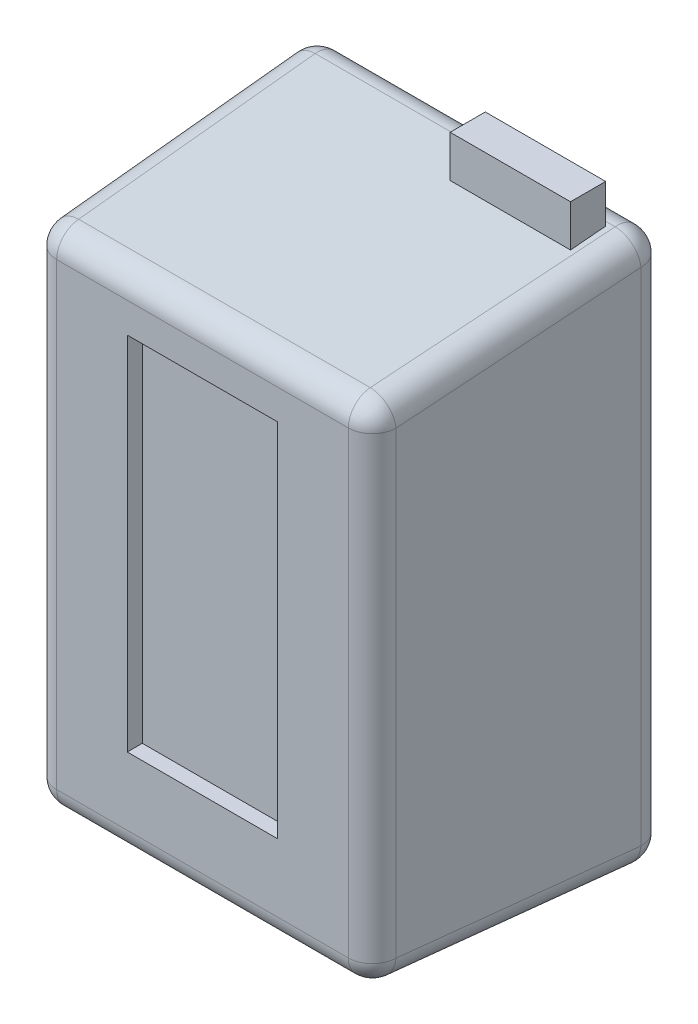
ISO-10303-21;
HEADER;
FILE_DESCRIPTION(('STEP AP214'),'2;1');
FILE_NAME('part.step','',(''),(''),'','','');
FILE_SCHEMA(('AUTOMOTIVE_DESIGN { 1 0 10303 214 1 1 1 1 }'));
ENDSEC;
DATA;
#1=APPLICATION_CONTEXT('core data for automotive mechanical design processes');
#2=APPLICATION_PROTOCOL_DEFINITION('international standard','automotive_design',2000,#1);
#3=PRODUCT_CONTEXT('',#1,'mechanical');
#4=PRODUCT('Part','Part','',(#3));
#5=PRODUCT_RELATED_PRODUCT_CATEGORY('part','',(#4));
#6=PRODUCT_DEFINITION_FORMATION('','',#4);
#7=PRODUCT_DEFINITION_CONTEXT('part definition',#1,'design');
#8=PRODUCT_DEFINITION('design','',#6,#7);
#9=PRODUCT_DEFINITION_SHAPE('','',#8);
#10=(LENGTH_UNIT() NAMED_UNIT(*) SI_UNIT(.MILLI.,.METRE.));
#11=(NAMED_UNIT(*) PLANE_ANGLE_UNIT() SI_UNIT($,.RADIAN.));
#12=(NAMED_UNIT(*) SI_UNIT($,.STERADIAN.) SOLID_ANGLE_UNIT());
#13=UNCERTAINTY_MEASURE_WITH_UNIT(LENGTH_MEASURE(1.E-05),#10,'distance_accuracy_value','');
#14=(GEOMETRIC_REPRESENTATION_CONTEXT(3) GLOBAL_UNCERTAINTY_ASSIGNED_CONTEXT((#13)) GLOBAL_UNIT_ASSIGNED_CONTEXT((#10,
#11,#12)) REPRESENTATION_CONTEXT('',''));
#15=CARTESIAN_POINT('',(0.,0.,0.));
#16=DIRECTION('',(0.,0.,1.));
#17=DIRECTION('',(1.,0.,0.));
#18=AXIS2_PLACEMENT_3D('',#15,#16,#17);
#19=CARTESIAN_POINT('',(0.,0.,57.785));
#20=DIRECTION('',(0.,0.,1.));
#21=DIRECTION('',(1.,0.,0.));
#22=AXIS2_PLACEMENT_3D('',#19,#20,#21);
#23=PLANE('',#22);
#24=DIRECTION('',(1.,0.,0.));
#25=VECTOR('',#24,1.);
#26=CARTESIAN_POINT('',(52.705,100.501728707451,57.785));
#27=LINE('',#26,#25);
#28=CARTESIAN_POINT('',(52.705,100.501728707451,57.785));
#29=VERTEX_POINT('',#28);
#30=CARTESIAN_POINT('',(20.955,100.501728707451,57.785));
#31=VERTEX_POINT('',#30);
#32=EDGE_CURVE('E779',#29,#31,#27,.F.);
#33=ORIENTED_EDGE('',*,*,#32,.T.);
#34=DIRECTION('',(0.,1.,0.));
#35=VECTOR('',#34,1.);
#36=CARTESIAN_POINT('',(20.955,100.501728707451,57.785));
#37=LINE('',#36,#35);
#38=CARTESIAN_POINT('',(20.955,24.3017287074512,57.785));
#39=VERTEX_POINT('',#38);
#40=EDGE_CURVE('E796',#31,#39,#37,.F.);
#41=ORIENTED_EDGE('',*,*,#40,.T.);
#42=DIRECTION('',(1.,0.,0.));
#43=VECTOR('',#42,1.);
#44=CARTESIAN_POINT('',(20.955,24.3017287074512,57.785));
#45=LINE('',#44,#43);
#46=CARTESIAN_POINT('',(52.705,24.3017287074512,57.785));
#47=VERTEX_POINT('',#46);
#48=EDGE_CURVE('E787',#39,#47,#45,.T.);
#49=ORIENTED_EDGE('',*,*,#48,.T.);
#50=DIRECTION('',(0.,1.,0.));
#51=VECTOR('',#50,1.);
#52=CARTESIAN_POINT('',(52.705,24.3017287074512,57.785));
#53=LINE('',#52,#51);
#54=EDGE_CURVE('E781',#47,#29,#53,.T.);
#55=ORIENTED_EDGE('',*,*,#54,.T.);
#56=EDGE_LOOP('',(#33,#41,#49,#55));
#57=FACE_BOUND('',#56,.T.);
#58=ADVANCED_FACE('F17',(#57),#23,.T.);
#59=CARTESIAN_POINT('',(52.705,100.501728707451,60.96));
#60=DIRECTION('',(0.,1.,0.));
#61=DIRECTION('',(0.,0.,1.));
#62=AXIS2_PLACEMENT_3D('',#59,#60,#61);
#63=PLANE('',#62);
#64=ORIENTED_EDGE('',*,*,#32,.F.);
#65=DIRECTION('',(0.,0.,-1.));
#66=VECTOR('',#65,1.);
#67=CARTESIAN_POINT('',(52.705,100.501728707451,60.96));
#68=LINE('',#67,#66);
#69=CARTESIAN_POINT('',(52.705,100.501728707451,60.96));
#70=VERTEX_POINT('',#69);
#71=EDGE_CURVE('E784',#29,#70,#68,.F.);
#72=ORIENTED_EDGE('',*,*,#71,.T.);
#73=DIRECTION('',(1.,0.,0.));
#74=VECTOR('',#73,1.);
#75=CARTESIAN_POINT('',(0.,100.501728707451,60.96));
#76=LINE('',#75,#74);
#77=CARTESIAN_POINT('',(20.955,100.501728707451,60.96));
#78=VERTEX_POINT('',#77);
#79=EDGE_CURVE('E237',#78,#70,#76,.T.);
#80=ORIENTED_EDGE('',*,*,#79,.F.);
#81=DIRECTION('',(0.,0.,1.));
#82=VECTOR('',#81,1.);
#83=CARTESIAN_POINT('',(20.955,100.501728707451,60.96));
#84=LINE('',#83,#82);
#85=EDGE_CURVE('E793',#78,#31,#84,.F.);
#86=ORIENTED_EDGE('',*,*,#85,.T.);
#87=EDGE_LOOP('',(#64,#72,#80,#86));
#88=FACE_BOUND('',#87,.T.);
#89=ADVANCED_FACE('F278',(#88),#63,.F.);
#90=CARTESIAN_POINT('',(52.705,24.3017287074512,60.96));
#91=DIRECTION('',(1.,0.,0.));
#92=DIRECTION('',(0.,0.,-1.));
#93=AXIS2_PLACEMENT_3D('',#90,#91,#92);
#94=PLANE('',#93);
#95=ORIENTED_EDGE('',*,*,#54,.F.);
#96=DIRECTION('',(0.,0.,-1.));
#97=VECTOR('',#96,1.);
#98=CARTESIAN_POINT('',(52.705,24.3017287074512,60.96));
#99=LINE('',#98,#97);
#100=CARTESIAN_POINT('',(52.705,24.3017287074512,60.96));
#101=VERTEX_POINT('',#100);
#102=EDGE_CURVE('E790',#47,#101,#99,.F.);
#103=ORIENTED_EDGE('',*,*,#102,.T.);
#104=DIRECTION('',(0.,1.,0.));
#105=VECTOR('',#104,1.);
#106=CARTESIAN_POINT('',(52.705,0.,60.96));
#107=LINE('',#106,#105);
#108=EDGE_CURVE('E230',#70,#101,#107,.F.);
#109=ORIENTED_EDGE('',*,*,#108,.F.);
#110=ORIENTED_EDGE('',*,*,#71,.F.);
#111=EDGE_LOOP('',(#95,#103,#109,#110));
#112=FACE_BOUND('',#111,.T.);
#113=ADVANCED_FACE('F275',(#112),#94,.F.);
#114=CARTESIAN_POINT('',(20.955,24.3017287074512,60.96));
#115=DIRECTION('',(0.,-1.,0.));
#116=DIRECTION('',(0.,0.,-1.));
#117=AXIS2_PLACEMENT_3D('',#114,#115,#116);
#118=PLANE('',#117);
#119=ORIENTED_EDGE('',*,*,#48,.F.);
#120=DIRECTION('',(0.,0.,1.));
#121=VECTOR('',#120,1.);
#122=CARTESIAN_POINT('',(20.955,24.3017287074512,60.96));
#123=LINE('',#122,#121);
#124=CARTESIAN_POINT('',(20.955,24.3017287074512,60.96));
#125=VERTEX_POINT('',#124);
#126=EDGE_CURVE('E239',#39,#125,#123,.T.);
#127=ORIENTED_EDGE('',*,*,#126,.T.);
#128=DIRECTION('',(1.,0.,0.));
#129=VECTOR('',#128,1.);
#130=CARTESIAN_POINT('',(0.,24.3017287074512,60.96));
#131=LINE('',#130,#129);
#132=EDGE_CURVE('E111',#101,#125,#131,.F.);
#133=ORIENTED_EDGE('',*,*,#132,.F.);
#134=ORIENTED_EDGE('',*,*,#102,.F.);
#135=EDGE_LOOP('',(#119,#127,#133,#134));
#136=FACE_BOUND('',#135,.T.);
#137=ADVANCED_FACE('F271',(#136),#118,.F.);
#138=CARTESIAN_POINT('',(20.955,100.501728707451,60.96));
#139=DIRECTION('',(-1.,0.,0.));
#140=DIRECTION('',(0.,0.,1.));
#141=AXIS2_PLACEMENT_3D('',#138,#139,#140);
#142=PLANE('',#141);
#143=ORIENTED_EDGE('',*,*,#40,.F.);
#144=ORIENTED_EDGE('',*,*,#85,.F.);
#145=DIRECTION('',(0.,1.,0.));
#146=VECTOR('',#145,1.);
#147=CARTESIAN_POINT('',(20.955,0.,60.96));
#148=LINE('',#147,#146);
#149=EDGE_CURVE('E224',#125,#78,#148,.T.);
#150=ORIENTED_EDGE('',*,*,#149,.F.);
#151=ORIENTED_EDGE('',*,*,#126,.F.);
#152=EDGE_LOOP('',(#143,#144,#150,#151));
#153=FACE_BOUND('',#152,.T.);
#154=ADVANCED_FACE('F267',(#153),#142,.F.);
#155=CARTESIAN_POINT('',(67.6038371453482,9.98827129254884,55.88));
#156=DIRECTION('',(-0.707537400109921,-0.704952373679696,0.0493252297415398));
#157=DIRECTION('',(0.706461997512717,-0.703880901465571,0.0739129394785272));
#158=AXIS2_PLACEMENT_3D('',#155,#156,#157);
#159=SPHERICAL_SURFACE('',#158,5.08);
#160=CARTESIAN_POINT('',(67.6038371453482,9.98827129254884,55.88));
#161=DIRECTION('',(1.,0.,0.));
#162=DIRECTION('',(0.,0.,-1.));
#163=AXIS2_PLACEMENT_3D('',#160,#161,#162);
#164=CIRCLE('',#163,5.08);
#165=CARTESIAN_POINT('',(67.6038371453482,4.92760222624277,56.3227511731581));
#166=VERTEX_POINT('',#165);
#167=CARTESIAN_POINT('',(67.6038371453482,9.98827129254883,60.96));
#168=VERTEX_POINT('',#167);
#169=EDGE_CURVE('E219',#166,#168,#164,.F.);
#170=ORIENTED_EDGE('',*,*,#169,.F.);
#171=CARTESIAN_POINT('',(67.6038371453482,9.98827129254884,55.88));
#172=DIRECTION('',(0.0173860148745836,-0.0871425693158092,-0.996044125076706));
#173=DIRECTION('',(0.,0.996194698091746,-0.0871557427476582));
#174=AXIS2_PLACEMENT_3D('',#171,#172,#173);
#175=CIRCLE('',#174,5.08);
#176=CARTESIAN_POINT('',(72.6830634367426,9.98827129254883,55.9686582247014));
#177=VERTEX_POINT('',#176);
#178=EDGE_CURVE('E214',#177,#166,#175,.T.);
#179=ORIENTED_EDGE('',*,*,#178,.F.);
#180=CARTESIAN_POINT('',(67.6038371453482,9.98827129254883,55.88));
#181=DIRECTION('',(0.,1.,0.));
#182=DIRECTION('',(0.,0.,1.));
#183=AXIS2_PLACEMENT_3D('',#180,#181,#182);
#184=CIRCLE('',#183,5.08);
#185=EDGE_CURVE('E218',#168,#177,#184,.T.);
#186=ORIENTED_EDGE('',*,*,#185,.F.);
#187=EDGE_LOOP('',(#170,#179,#186));
#188=FACE_BOUND('',#187,.T.);
#189=ADVANCED_FACE('F264',(#188),#159,.T.);
#190=CARTESIAN_POINT('',(0.,124.46,0.));
#191=DIRECTION('',(0.,1.,0.));
#192=DIRECTION('',(0.,0.,1.));
#193=AXIS2_PLACEMENT_3D('',#190,#191,#192);
#194=PLANE('',#193);
#195=DIRECTION('',(-1.,0.,0.));
#196=VECTOR('',#195,1.);
#197=CARTESIAN_POINT('',(67.31,124.46,6.35));
#198=LINE('',#197,#196);
#199=CARTESIAN_POINT('',(41.91,124.46,6.35));
#200=VERTEX_POINT('',#199);
#201=CARTESIAN_POINT('',(67.31,124.46,6.35));
#202=VERTEX_POINT('',#201);
#203=EDGE_CURVE('E261',#200,#202,#198,.F.);
#204=ORIENTED_EDGE('',*,*,#203,.F.);
#205=DIRECTION('',(0.,0.,1.));
#206=VECTOR('',#205,1.);
#207=CARTESIAN_POINT('',(41.91,124.46,6.35));
#208=LINE('',#207,#206);
#209=CARTESIAN_POINT('',(41.91,124.46,13.7703514925396));
#210=VERTEX_POINT('',#209);
#211=EDGE_CURVE('E455',#210,#200,#208,.F.);
#212=ORIENTED_EDGE('',*,*,#211,.F.);
#213=DIRECTION('',(1.,0.,0.));
#214=VECTOR('',#213,1.);
#215=CARTESIAN_POINT('',(41.91,124.46,13.7703514925396));
#216=LINE('',#215,#214);
#217=CARTESIAN_POINT('',(67.31,124.46,13.7703514925396));
#218=VERTEX_POINT('',#217);
#219=EDGE_CURVE('E461',#218,#210,#216,.F.);
#220=ORIENTED_EDGE('',*,*,#219,.F.);
#221=DIRECTION('',(0.,0.,-1.));
#222=VECTOR('',#221,1.);
#223=CARTESIAN_POINT('',(67.31,124.46,13.7703514925396));
#224=LINE('',#223,#222);
#225=EDGE_CURVE('E467',#202,#218,#224,.F.);
#226=ORIENTED_EDGE('',*,*,#225,.F.);
#227=EDGE_LOOP('',(#204,#212,#220,#226));
#228=FACE_BOUND('',#227,.T.);
#229=ADVANCED_FACE('F254',(#228),#194,.T.);
#230=CARTESIAN_POINT('',(67.6038371453482,106.851728707451,55.88));
#231=DIRECTION('',(0.707537399602829,-0.704952374189057,-0.0493252297356972));
#232=DIRECTION('',(0.706461998019121,0.70388090095842,0.0739129394679565));
#233=AXIS2_PLACEMENT_3D('',#230,#231,#232);
#234=SPHERICAL_SURFACE('',#233,5.08);
#235=CARTESIAN_POINT('',(67.6038371453482,106.851728707451,55.88));
#236=DIRECTION('',(0.,1.,0.));
#237=DIRECTION('',(0.,0.,1.));
#238=AXIS2_PLACEMENT_3D('',#235,#236,#237);
#239=CIRCLE('',#238,5.08);
#240=CARTESIAN_POINT('',(72.6830634367426,106.851728707451,55.9686582247015));
#241=VERTEX_POINT('',#240);
#242=CARTESIAN_POINT('',(67.6038371453481,106.851728707451,60.96));
#243=VERTEX_POINT('',#242);
#244=EDGE_CURVE('E215',#241,#243,#239,.F.);
#245=ORIENTED_EDGE('',*,*,#244,.F.);
#246=CARTESIAN_POINT('',(67.6038371453482,106.851728707451,55.88));
#247=DIRECTION('',(0.0173860148745836,0.0871425693158093,-0.996044125076706));
#248=DIRECTION('',(0.,0.996194698091745,0.0871557427476582));
#249=AXIS2_PLACEMENT_3D('',#246,#247,#248);
#250=CIRCLE('',#249,5.08);
#251=CARTESIAN_POINT('',(67.6038371453481,111.912397773757,56.3227511731581));
#252=VERTEX_POINT('',#251);
#253=EDGE_CURVE('E430',#252,#241,#250,.T.);
#254=ORIENTED_EDGE('',*,*,#253,.F.);
#255=CARTESIAN_POINT('',(67.6038371453481,106.851728707451,55.88));
#256=DIRECTION('',(-1.,0.,0.));
#257=DIRECTION('',(0.,0.,1.));
#258=AXIS2_PLACEMENT_3D('',#255,#256,#257);
#259=CIRCLE('',#258,5.08);
#260=EDGE_CURVE('E212',#243,#252,#259,.T.);
#261=ORIENTED_EDGE('',*,*,#260,.F.);
#262=EDGE_LOOP('',(#245,#254,#261));
#263=FACE_BOUND('',#262,.T.);
#264=ADVANCED_FACE('F249',(#263),#234,.T.);
#265=CARTESIAN_POINT('',(6.05616285465185,9.98827129254884,55.88));
#266=DIRECTION('',(-0.707537399602827,0.704952374189059,-0.0493252297356956));
#267=DIRECTION('',(-0.706461998019123,-0.703880900958418,0.0739129394679551));
#268=AXIS2_PLACEMENT_3D('',#265,#266,#267);
#269=SPHERICAL_SURFACE('',#268,5.08);
#270=CARTESIAN_POINT('',(6.05616285465185,9.98827129254883,55.88));
#271=DIRECTION('',(0.,-1.,0.));
#272=DIRECTION('',(0.,0.,-1.));
#273=AXIS2_PLACEMENT_3D('',#270,#271,#272);
#274=CIRCLE('',#273,5.08);
#275=CARTESIAN_POINT('',(0.976936563257381,9.98827129254883,55.9686582247013));
#276=VERTEX_POINT('',#275);
#277=CARTESIAN_POINT('',(6.05616285465185,9.98827129254883,60.96));
#278=VERTEX_POINT('',#277);
#279=EDGE_CURVE('E202',#276,#278,#274,.F.);
#280=ORIENTED_EDGE('',*,*,#279,.F.);
#281=CARTESIAN_POINT('',(6.05616285465185,9.98827129254884,55.88));
#282=DIRECTION('',(-0.0173860148745836,-0.0871425693158092,-0.996044125076706));
#283=DIRECTION('',(0.,0.996194698091746,-0.0871557427476582));
#284=AXIS2_PLACEMENT_3D('',#281,#282,#283);
#285=CIRCLE('',#284,5.08);
#286=CARTESIAN_POINT('',(6.05616285465185,4.92760222624277,56.3227511731581));
#287=VERTEX_POINT('',#286);
#288=EDGE_CURVE('E208',#287,#276,#285,.T.);
#289=ORIENTED_EDGE('',*,*,#288,.F.);
#290=CARTESIAN_POINT('',(6.05616285465185,9.98827129254884,55.88));
#291=DIRECTION('',(1.,0.,0.));
#292=DIRECTION('',(0.,0.,-1.));
#293=AXIS2_PLACEMENT_3D('',#290,#291,#292);
#294=CIRCLE('',#293,5.08);
#295=EDGE_CURVE('E20',#278,#287,#294,.T.);
#296=ORIENTED_EDGE('',*,*,#295,.F.);
#297=EDGE_LOOP('',(#280,#289,#296));
#298=FACE_BOUND('',#297,.T.);
#299=ADVANCED_FACE('F244',(#298),#269,.T.);
#300=CARTESIAN_POINT('',(0.,0.,60.96));
#301=DIRECTION('',(0.,0.,1.));
#302=DIRECTION('',(1.,0.,0.));
#303=AXIS2_PLACEMENT_3D('',#300,#301,#302);
#304=PLANE('',#303);
#305=ORIENTED_EDGE('',*,*,#132,.T.);
#306=ORIENTED_EDGE('',*,*,#149,.T.);
#307=ORIENTED_EDGE('',*,*,#79,.T.);
#308=ORIENTED_EDGE('',*,*,#108,.T.);
#309=EDGE_LOOP('',(#305,#306,#307,#308));
#310=FACE_BOUND('',#309,.T.);
#311=DIRECTION('',(-1.,0.,0.));
#312=VECTOR('',#311,1.);
#313=CARTESIAN_POINT('',(68.9304013414186,106.851728707451,60.96));
#314=LINE('',#313,#312);
#315=CARTESIAN_POINT('',(6.05616285465185,106.851728707451,60.96));
#316=VERTEX_POINT('',#315);
#317=EDGE_CURVE('E211',#316,#243,#314,.F.);
#318=ORIENTED_EDGE('',*,*,#317,.F.);
#319=DIRECTION('',(0.,-1.,0.));
#320=VECTOR('',#319,1.);
#321=CARTESIAN_POINT('',(6.05616285465185,111.752724571596,60.96));
#322=LINE('',#321,#320);
#323=EDGE_CURVE('E205',#278,#316,#322,.F.);
#324=ORIENTED_EDGE('',*,*,#323,.F.);
#325=DIRECTION('',(1.,0.,0.));
#326=VECTOR('',#325,1.);
#327=CARTESIAN_POINT('',(4.72959865858138,9.98827129254884,60.96));
#328=LINE('',#327,#326);
#329=EDGE_CURVE('E102',#168,#278,#328,.F.);
#330=ORIENTED_EDGE('',*,*,#329,.F.);
#331=DIRECTION('',(0.,1.,0.));
#332=VECTOR('',#331,1.);
#333=CARTESIAN_POINT('',(67.6038371453482,5.09619980306344,60.96));
#334=LINE('',#333,#332);
#335=EDGE_CURVE('E217',#243,#168,#334,.F.);
#336=ORIENTED_EDGE('',*,*,#335,.F.);
#337=EDGE_LOOP('',(#318,#324,#330,#336));
#338=FACE_BOUND('',#337,.T.);
#339=ADVANCED_FACE('F248',(#310,#338),#304,.T.);
#340=CARTESIAN_POINT('',(6.05616285465185,106.851728707451,55.88));
#341=DIRECTION('',(0.707537400109922,0.704952373679695,0.0493252297415399));
#342=DIRECTION('',(-0.706461997512717,0.703880901465572,0.0739129394785272));
#343=AXIS2_PLACEMENT_3D('',#340,#341,#342);
#344=SPHERICAL_SURFACE('',#343,5.08);
#345=CARTESIAN_POINT('',(6.05616285465185,106.851728707451,55.88));
#346=DIRECTION('',(-1.,0.,0.));
#347=DIRECTION('',(0.,0.,1.));
#348=AXIS2_PLACEMENT_3D('',#345,#346,#347);
#349=CIRCLE('',#348,5.08);
#350=CARTESIAN_POINT('',(6.05616285465185,111.912397773757,56.3227511731581));
#351=VERTEX_POINT('',#350);
#352=EDGE_CURVE('E209',#351,#316,#349,.F.);
#353=ORIENTED_EDGE('',*,*,#352,.F.);
#354=CARTESIAN_POINT('',(6.05616285465185,106.851728707451,55.88));
#355=DIRECTION('',(-0.0173860148745836,0.0871425693158093,-0.996044125076706));
#356=DIRECTION('',(0.,0.996194698091745,0.0871557427476582));
#357=AXIS2_PLACEMENT_3D('',#354,#355,#356);
#358=CIRCLE('',#357,5.08);
#359=CARTESIAN_POINT('',(0.976936563257382,106.851728707451,55.9686582247014));
#360=VERTEX_POINT('',#359);
#361=EDGE_CURVE('E421',#360,#351,#358,.T.);
#362=ORIENTED_EDGE('',*,*,#361,.F.);
#363=CARTESIAN_POINT('',(6.05616285465185,106.851728707451,55.88));
#364=DIRECTION('',(0.,-1.,0.));
#365=DIRECTION('',(0.,0.,-1.));
#366=AXIS2_PLACEMENT_3D('',#363,#364,#365);
#367=CIRCLE('',#366,5.08);
#368=EDGE_CURVE('E206',#316,#360,#367,.T.);
#369=ORIENTED_EDGE('',*,*,#368,.F.);
#370=EDGE_LOOP('',(#353,#362,#369));
#371=FACE_BOUND('',#370,.T.);
#372=ADVANCED_FACE('F412',(#371),#344,.T.);
#373=CARTESIAN_POINT('',(4.72959865858138,9.98827129254884,55.88));
#374=DIRECTION('',(1.,0.,0.));
#375=DIRECTION('',(0.,0.,-1.));
#376=AXIS2_PLACEMENT_3D('',#373,#374,#375);
#377=CYLINDRICAL_SURFACE('',#376,5.08);
#378=ORIENTED_EDGE('',*,*,#169,.T.);
#379=ORIENTED_EDGE('',*,*,#329,.T.);
#380=ORIENTED_EDGE('',*,*,#295,.T.);
#381=DIRECTION('',(1.,0.,0.));
#382=VECTOR('',#381,1.);
#383=CARTESIAN_POINT('',(-27.2833581887681,4.92760222624277,56.3227511731581));
#384=LINE('',#383,#382);
#385=EDGE_CURVE('E436',#166,#287,#384,.F.);
#386=ORIENTED_EDGE('',*,*,#385,.F.);
#387=EDGE_LOOP('',(#378,#379,#380,#386));
#388=FACE_BOUND('',#387,.T.);
#389=ADVANCED_FACE('F409',(#388),#377,.T.);
#390=CARTESIAN_POINT('',(67.6038371453482,5.09619980306344,55.88));
#391=DIRECTION('',(0.,1.,0.));
#392=DIRECTION('',(0.,0.,1.));
#393=AXIS2_PLACEMENT_3D('',#390,#391,#392);
#394=CYLINDRICAL_SURFACE('',#393,5.08);
#395=ORIENTED_EDGE('',*,*,#244,.T.);
#396=ORIENTED_EDGE('',*,*,#335,.T.);
#397=ORIENTED_EDGE('',*,*,#185,.T.);
#398=DIRECTION('',(0.,1.,0.));
#399=VECTOR('',#398,1.);
#400=CARTESIAN_POINT('',(72.6830634367426,-27.2833581887681,55.9686582247014));
#401=LINE('',#400,#399);
#402=EDGE_CURVE('E433',#241,#177,#401,.F.);
#403=ORIENTED_EDGE('',*,*,#402,.F.);
#404=EDGE_LOOP('',(#395,#396,#397,#403));
#405=FACE_BOUND('',#404,.T.);
#406=ADVANCED_FACE('F405',(#405),#394,.T.);
#407=CARTESIAN_POINT('',(66.1280558113525,17.3852152225057,140.427456));
#408=DIRECTION('',(0.0173860148745836,-0.0871425693158092,-0.996044125076706));
#409=DIRECTION('',(0.,0.996194698091746,-0.0871557427476582));
#410=AXIS2_PLACEMENT_3D('',#407,#408,#409);
#411=CYLINDRICAL_SURFACE('',#410,5.08);
#412=DIRECTION('',(0.0173860148745835,-0.0871425693158092,-0.996044125076706));
#413=VECTOR('',#412,1.);
#414=CARTESIAN_POINT('',(72.6830634367426,9.98827129254884,55.9686582247014));
#415=LINE('',#414,#413);
#416=CARTESIAN_POINT('',(73.5697807350925,5.5438471877946,5.16865822490805));
#417=VERTEX_POINT('',#416);
#418=EDGE_CURVE('E438',#177,#417,#415,.T.);
#419=ORIENTED_EDGE('',*,*,#418,.F.);
#420=ORIENTED_EDGE('',*,*,#178,.T.);
#421=DIRECTION('',(-0.0173860148745835,0.0871425693158093,0.996044125076706));
#422=VECTOR('',#421,1.);
#423=CARTESIAN_POINT('',(68.4905544437016,0.483178119125831,5.5227511731581));
#424=LINE('',#423,#422);
#425=CARTESIAN_POINT('',(68.4905544389365,0.483178119140131,5.52275117332153));
#426=VERTEX_POINT('',#425);
#427=EDGE_CURVE('E439',#426,#166,#424,.T.);
#428=ORIENTED_EDGE('',*,*,#427,.F.);
#429=CARTESIAN_POINT('',(68.4905544437016,5.5438471854319,5.08));
#430=DIRECTION('',(0.0173860149555573,-0.087142569364098,-0.996044125071068));
#431=DIRECTION('',(0.706461997512716,-0.703880901465573,0.0739129394785234));
#432=AXIS2_PLACEMENT_3D('',#429,#430,#431);
#433=CIRCLE('',#432,5.08);
#434=EDGE_CURVE('E159',#417,#426,#433,.T.);
#435=ORIENTED_EDGE('',*,*,#434,.F.);
#436=EDGE_LOOP('',(#419,#420,#428,#435));
#437=FACE_BOUND('',#436,.T.);
#438=ADVANCED_FACE('F401',(#437),#411,.T.);
#439=CARTESIAN_POINT('',(68.9304013414186,106.851728707451,55.88));
#440=DIRECTION('',(-1.,0.,0.));
#441=DIRECTION('',(0.,0.,1.));
#442=AXIS2_PLACEMENT_3D('',#439,#440,#441);
#443=CYLINDRICAL_SURFACE('',#442,5.08);
#444=ORIENTED_EDGE('',*,*,#352,.T.);
#445=ORIENTED_EDGE('',*,*,#317,.T.);
#446=ORIENTED_EDGE('',*,*,#260,.T.);
#447=DIRECTION('',(1.,0.,0.));
#448=VECTOR('',#447,1.);
#449=CARTESIAN_POINT('',(100.943358188768,111.912397773757,56.3227511731581));
#450=LINE('',#449,#448);
#451=EDGE_CURVE('E155',#351,#252,#450,.T.);
#452=ORIENTED_EDGE('',*,*,#451,.F.);
#453=EDGE_LOOP('',(#444,#445,#446,#452));
#454=FACE_BOUND('',#453,.T.);
#455=ADVANCED_FACE('F397',(#454),#443,.T.);
#456=CARTESIAN_POINT('',(67.31,116.84,6.35));
#457=DIRECTION('',(0.,0.,-1.));
#458=DIRECTION('',(-1.,0.,0.));
#459=AXIS2_PLACEMENT_3D('',#456,#457,#458);
#460=PLANE('',#459);
#461=DIRECTION('',(0.,1.,0.));
#462=VECTOR('',#461,1.);
#463=CARTESIAN_POINT('',(67.31,116.84,6.35));
#464=LINE('',#463,#462);
#465=CARTESIAN_POINT('',(67.31,116.28444698661,6.35));
#466=VERTEX_POINT('',#465);
#467=EDGE_CURVE('E469',#466,#202,#464,.T.);
#468=ORIENTED_EDGE('',*,*,#467,.F.);
#469=DIRECTION('',(1.,0.,0.));
#470=VECTOR('',#469,1.);
#471=CARTESIAN_POINT('',(100.943358188768,116.28444698661,6.35));
#472=LINE('',#471,#470);
#473=CARTESIAN_POINT('',(41.91,116.28444698661,6.35));
#474=VERTEX_POINT('',#473);
#475=EDGE_CURVE('E349',#474,#466,#472,.T.);
#476=ORIENTED_EDGE('',*,*,#475,.F.);
#477=DIRECTION('',(0.,1.,0.));
#478=VECTOR('',#477,1.);
#479=CARTESIAN_POINT('',(41.91,116.84,6.35));
#480=LINE('',#479,#478);
#481=EDGE_CURVE('E432',#200,#474,#480,.F.);
#482=ORIENTED_EDGE('',*,*,#481,.F.);
#483=ORIENTED_EDGE('',*,*,#203,.T.);
#484=EDGE_LOOP('',(#468,#476,#482,#483));
#485=FACE_BOUND('',#484,.T.);
#486=ADVANCED_FACE('F393',(#485),#460,.T.);
#487=CARTESIAN_POINT('',(67.31,116.84,13.7703514925396));
#488=DIRECTION('',(1.,0.,0.));
#489=DIRECTION('',(0.,0.,-1.));
#490=AXIS2_PLACEMENT_3D('',#487,#488,#489);
#491=PLANE('',#490);
#492=DIRECTION('',(0.,1.,0.));
#493=VECTOR('',#492,1.);
#494=CARTESIAN_POINT('',(67.31,116.84,13.7703514925396));
#495=LINE('',#494,#493);
#496=CARTESIAN_POINT('',(67.31,115.635250351635,13.7703514925396));
#497=VERTEX_POINT('',#496);
#498=EDGE_CURVE('E464',#497,#218,#495,.T.);
#499=ORIENTED_EDGE('',*,*,#498,.F.);
#500=DIRECTION('',(0.,-0.0871557427476582,0.996194698091746));
#501=VECTOR('',#500,1.);
#502=CARTESIAN_POINT('',(67.31,116.84,0.));
#503=LINE('',#502,#501);
#504=EDGE_CURVE('E346',#466,#497,#503,.T.);
#505=ORIENTED_EDGE('',*,*,#504,.F.);
#506=ORIENTED_EDGE('',*,*,#467,.T.);
#507=ORIENTED_EDGE('',*,*,#225,.T.);
#508=EDGE_LOOP('',(#499,#505,#506,#507));
#509=FACE_BOUND('',#508,.T.);
#510=ADVANCED_FACE('F389',(#509),#491,.T.);
#511=CARTESIAN_POINT('',(41.91,116.84,13.7703514925396));
#512=DIRECTION('',(0.,0.,1.));
#513=DIRECTION('',(1.,0.,0.));
#514=AXIS2_PLACEMENT_3D('',#511,#512,#513);
#515=PLANE('',#514);
#516=DIRECTION('',(0.,1.,0.));
#517=VECTOR('',#516,1.);
#518=CARTESIAN_POINT('',(41.91,116.84,13.7703514925396));
#519=LINE('',#518,#517);
#520=CARTESIAN_POINT('',(41.91,115.635250351635,13.7703514925396));
#521=VERTEX_POINT('',#520);
#522=EDGE_CURVE('E458',#521,#210,#519,.T.);
#523=ORIENTED_EDGE('',*,*,#522,.F.);
#524=DIRECTION('',(1.,0.,0.));
#525=VECTOR('',#524,1.);
#526=CARTESIAN_POINT('',(100.943358188768,115.635250351635,13.7703514925396));
#527=LINE('',#526,#525);
#528=EDGE_CURVE('E343',#497,#521,#527,.F.);
#529=ORIENTED_EDGE('',*,*,#528,.F.);
#530=ORIENTED_EDGE('',*,*,#498,.T.);
#531=ORIENTED_EDGE('',*,*,#219,.T.);
#532=EDGE_LOOP('',(#523,#529,#530,#531));
#533=FACE_BOUND('',#532,.T.);
#534=ADVANCED_FACE('F385',(#533),#515,.T.);
#535=CARTESIAN_POINT('',(41.91,116.84,6.35));
#536=DIRECTION('',(-1.,0.,0.));
#537=DIRECTION('',(0.,0.,1.));
#538=AXIS2_PLACEMENT_3D('',#535,#536,#537);
#539=PLANE('',#538);
#540=ORIENTED_EDGE('',*,*,#481,.T.);
#541=DIRECTION('',(0.,-0.0871557427476582,0.996194698091746));
#542=VECTOR('',#541,1.);
#543=CARTESIAN_POINT('',(41.91,116.84,0.));
#544=LINE('',#543,#542);
#545=EDGE_CURVE('E179',#521,#474,#544,.F.);
#546=ORIENTED_EDGE('',*,*,#545,.F.);
#547=ORIENTED_EDGE('',*,*,#522,.T.);
#548=ORIENTED_EDGE('',*,*,#211,.T.);
#549=EDGE_LOOP('',(#540,#546,#547,#548));
#550=FACE_BOUND('',#549,.T.);
#551=ADVANCED_FACE('F382',(#550),#539,.T.);
#552=CARTESIAN_POINT('',(66.1280558113525,99.4547847774943,140.427456));
#553=DIRECTION('',(0.0173860148745836,0.0871425693158093,-0.996044125076706));
#554=DIRECTION('',(0.,0.996194698091745,0.0871557427476582));
#555=AXIS2_PLACEMENT_3D('',#552,#553,#554);
#556=CYLINDRICAL_SURFACE('',#555,5.08);
#557=DIRECTION('',(0.0173860148745835,0.0871425693158091,-0.996044125076706));
#558=VECTOR('',#557,1.);
#559=CARTESIAN_POINT('',(67.6038371453482,111.912397773757,56.3227511731581));
#560=LINE('',#559,#558);
#561=CARTESIAN_POINT('',(68.4905544401249,116.356821880869,5.52275117322006));
#562=VERTEX_POINT('',#561);
#563=EDGE_CURVE('E149',#252,#562,#560,.T.);
#564=ORIENTED_EDGE('',*,*,#563,.F.);
#565=ORIENTED_EDGE('',*,*,#253,.T.);
#566=DIRECTION('',(-0.0173860148745835,-0.0871425693158091,0.996044125076706));
#567=VECTOR('',#566,1.);
#568=CARTESIAN_POINT('',(73.5697807350961,111.296152814568,5.1686582247014));
#569=LINE('',#568,#567);
#570=CARTESIAN_POINT('',(73.5697807350897,111.296152810554,5.16865822506596));
#571=VERTEX_POINT('',#570);
#572=EDGE_CURVE('E175',#571,#241,#569,.T.);
#573=ORIENTED_EDGE('',*,*,#572,.F.);
#574=CARTESIAN_POINT('',(68.4905544437016,111.296152814568,5.08));
#575=DIRECTION('',(0.0173860150148844,0.0871425693399858,-0.996044125072142));
#576=DIRECTION('',(0.706461998019121,0.703880900958421,0.0739129394679521));
#577=AXIS2_PLACEMENT_3D('',#574,#575,#576);
#578=CIRCLE('',#577,5.08);
#579=EDGE_CURVE('E172',#562,#571,#578,.T.);
#580=ORIENTED_EDGE('',*,*,#579,.F.);
#581=EDGE_LOOP('',(#564,#565,#573,#580));
#582=FACE_BOUND('',#581,.T.);
#583=ADVANCED_FACE('F173',(#582),#556,.T.);
#584=CARTESIAN_POINT('',(7.53194418864747,17.3852152225057,140.427456));
#585=DIRECTION('',(-0.0173860148745836,-0.0871425693158092,-0.996044125076706));
#586=DIRECTION('',(0.,0.996194698091746,-0.0871557427476582));
#587=AXIS2_PLACEMENT_3D('',#584,#585,#586);
#588=CYLINDRICAL_SURFACE('',#587,5.08);
#589=DIRECTION('',(-0.0173860148745836,-0.0871425693158093,-0.996044125076706));
#590=VECTOR('',#589,1.);
#591=CARTESIAN_POINT('',(6.05616285465185,4.92760222624277,56.3227511731581));
#592=LINE('',#591,#590);
#593=CARTESIAN_POINT('',(5.16944555987517,0.483178119131253,5.52275117322006));
#594=VERTEX_POINT('',#593);
#595=EDGE_CURVE('E443',#287,#594,#592,.T.);
#596=ORIENTED_EDGE('',*,*,#595,.F.);
#597=ORIENTED_EDGE('',*,*,#288,.T.);
#598=DIRECTION('',(0.0173860148745836,0.0871425693158096,0.996044125076706));
#599=VECTOR('',#598,1.);
#600=CARTESIAN_POINT('',(0.0902192649039288,5.54384718543188,5.1686582247014));
#601=LINE('',#600,#599);
#602=CARTESIAN_POINT('',(0.0902192649102922,5.54384718944596,5.16865822506596));
#603=VERTEX_POINT('',#602);
#604=EDGE_CURVE('E323',#603,#276,#601,.T.);
#605=ORIENTED_EDGE('',*,*,#604,.F.);
#606=CARTESIAN_POINT('',(5.1694455562984,5.5438471854319,5.08));
#607=DIRECTION('',(-0.0173860150148848,-0.0871425693399858,-0.996044125072142));
#608=DIRECTION('',(-0.706461998019123,-0.703880900958418,0.0739129394679522));
#609=AXIS2_PLACEMENT_3D('',#606,#607,#608);
#610=CIRCLE('',#609,5.08);
#611=EDGE_CURVE('E142',#594,#603,#610,.T.);
#612=ORIENTED_EDGE('',*,*,#611,.F.);
#613=EDGE_LOOP('',(#596,#597,#605,#612));
#614=FACE_BOUND('',#613,.T.);
#615=ADVANCED_FACE('F375',(#614),#588,.T.);
#616=CARTESIAN_POINT('',(6.05616285465185,111.752724571596,55.88));
#617=DIRECTION('',(0.,-1.,0.));
#618=DIRECTION('',(0.,0.,-1.));
#619=AXIS2_PLACEMENT_3D('',#616,#617,#618);
#620=CYLINDRICAL_SURFACE('',#619,5.08);
#621=ORIENTED_EDGE('',*,*,#279,.T.);
#622=ORIENTED_EDGE('',*,*,#323,.T.);
#623=ORIENTED_EDGE('',*,*,#368,.T.);
#624=DIRECTION('',(0.,1.,0.));
#625=VECTOR('',#624,1.);
#626=CARTESIAN_POINT('',(0.976936563257382,144.123358188768,55.9686582247014));
#627=LINE('',#626,#625);
#628=EDGE_CURVE('E317',#276,#360,#627,.T.);
#629=ORIENTED_EDGE('',*,*,#628,.F.);
#630=EDGE_LOOP('',(#621,#622,#623,#629));
#631=FACE_BOUND('',#630,.T.);
#632=ADVANCED_FACE('F371',(#631),#620,.T.);
#633=CARTESIAN_POINT('',(7.53194418864747,99.4547847774943,140.427456));
#634=DIRECTION('',(-0.0173860148745836,0.0871425693158093,-0.996044125076706));
#635=DIRECTION('',(0.,0.996194698091745,0.0871557427476582));
#636=AXIS2_PLACEMENT_3D('',#633,#634,#635);
#637=CYLINDRICAL_SURFACE('',#636,5.08);
#638=DIRECTION('',(-0.0173860148745836,0.0871425693158091,-0.996044125076706));
#639=VECTOR('',#638,1.);
#640=CARTESIAN_POINT('',(0.976936563257382,106.851728707451,55.9686582247014));
#641=LINE('',#640,#639);
#642=CARTESIAN_POINT('',(0.0902192649075364,111.296152812205,5.16865822490804));
#643=VERTEX_POINT('',#642);
#644=EDGE_CURVE('E321',#360,#643,#641,.T.);
#645=ORIENTED_EDGE('',*,*,#644,.F.);
#646=ORIENTED_EDGE('',*,*,#361,.T.);
#647=DIRECTION('',(0.0173860148745838,-0.0871425693158091,0.996044125076706));
#648=VECTOR('',#647,1.);
#649=CARTESIAN_POINT('',(5.16944555629839,116.356821880874,5.5227511731581));
#650=LINE('',#649,#648);
#651=CARTESIAN_POINT('',(5.16944556106346,116.35682188086,5.52275117332153));
#652=VERTEX_POINT('',#651);
#653=EDGE_CURVE('E158',#652,#351,#650,.T.);
#654=ORIENTED_EDGE('',*,*,#653,.F.);
#655=CARTESIAN_POINT('',(5.1694455562984,111.296152814568,5.08));
#656=DIRECTION('',(-0.0173860149555571,0.0871425693640979,-0.996044125071068));
#657=DIRECTION('',(-0.706461997512717,0.703880901465572,0.073912939478523));
#658=AXIS2_PLACEMENT_3D('',#655,#656,#657);
#659=CIRCLE('',#658,5.08);
#660=EDGE_CURVE('E201',#643,#652,#659,.T.);
#661=ORIENTED_EDGE('',*,*,#660,.F.);
#662=EDGE_LOOP('',(#645,#646,#654,#661));
#663=FACE_BOUND('',#662,.T.);
#664=ADVANCED_FACE('F367',(#663),#637,.T.);
#665=CARTESIAN_POINT('',(-27.2833581887681,0.,0.));
#666=DIRECTION('',(0.,-0.996194698091746,0.0871557427476582));
#667=DIRECTION('',(0.,-0.0871557427476582,-0.996194698091746));
#668=AXIS2_PLACEMENT_3D('',#665,#666,#667);
#669=PLANE('',#668);
#670=ORIENTED_EDGE('',*,*,#427,.T.);
#671=ORIENTED_EDGE('',*,*,#385,.T.);
#672=ORIENTED_EDGE('',*,*,#595,.T.);
#673=DIRECTION('',(-1.,0.,0.));
#674=VECTOR('',#673,1.);
#675=CARTESIAN_POINT('',(68.8287238466152,0.483178119125832,5.5227511731581));
#676=LINE('',#675,#674);
#677=EDGE_CURVE('E197',#426,#594,#676,.T.);
#678=ORIENTED_EDGE('',*,*,#677,.F.);
#679=EDGE_LOOP('',(#670,#671,#672,#678));
#680=FACE_BOUND('',#679,.T.);
#681=ADVANCED_FACE('F363',(#680),#669,.T.);
#682=CARTESIAN_POINT('',(73.66,-27.2833581887681,0.));
#683=DIRECTION('',(0.999847695156391,0.,0.0174524064372835));
#684=DIRECTION('',(0.0174524064372835,0.,-0.999847695156391));
#685=AXIS2_PLACEMENT_3D('',#682,#683,#684);
#686=PLANE('',#685);
#687=ORIENTED_EDGE('',*,*,#572,.T.);
#688=ORIENTED_EDGE('',*,*,#402,.T.);
#689=ORIENTED_EDGE('',*,*,#418,.T.);
#690=DIRECTION('',(0.,-1.,0.));
#691=VECTOR('',#690,1.);
#692=CARTESIAN_POINT('',(73.5697807350961,111.990121237473,5.1686582247014));
#693=LINE('',#692,#691);
#694=EDGE_CURVE('E193',#571,#417,#693,.T.);
#695=ORIENTED_EDGE('',*,*,#694,.F.);
#696=EDGE_LOOP('',(#687,#688,#689,#695));
#697=FACE_BOUND('',#696,.T.);
#698=ADVANCED_FACE('F359',(#697),#686,.T.);
#699=CARTESIAN_POINT('',(68.4905544437016,5.5438471854319,5.08));
#700=DIRECTION('',(0.707537400109922,0.704952373679695,-0.0493252297415395));
#701=DIRECTION('',(0.706461997512716,-0.703880901465573,0.0739129394785233));
#702=AXIS2_PLACEMENT_3D('',#699,#700,#701);
#703=SPHERICAL_SURFACE('',#702,5.08);
#704=CARTESIAN_POINT('',(68.4905544437016,5.5438471854319,5.08));
#705=DIRECTION('',(0.,-1.,0.));
#706=DIRECTION('',(0.,0.,-1.));
#707=AXIS2_PLACEMENT_3D('',#704,#705,#706);
#708=CIRCLE('',#707,5.08);
#709=CARTESIAN_POINT('',(68.4905544437016,5.5438471854319,0.));
#710=VERTEX_POINT('',#709);
#711=EDGE_CURVE('E191',#417,#710,#708,.F.);
#712=ORIENTED_EDGE('',*,*,#711,.F.);
#713=ORIENTED_EDGE('',*,*,#434,.T.);
#714=CARTESIAN_POINT('',(68.4905544437016,5.5438471854319,5.08));
#715=DIRECTION('',(-1.,0.,0.));
#716=DIRECTION('',(0.,0.,1.));
#717=AXIS2_PLACEMENT_3D('',#714,#715,#716);
#718=CIRCLE('',#717,5.08);
#719=EDGE_CURVE('E198',#710,#426,#718,.T.);
#720=ORIENTED_EDGE('',*,*,#719,.F.);
#721=EDGE_LOOP('',(#712,#713,#720));
#722=FACE_BOUND('',#721,.T.);
#723=ADVANCED_FACE('F356',(#722),#703,.T.);
#724=CARTESIAN_POINT('',(100.943358188768,116.84,0.));
#725=DIRECTION('',(0.,0.996194698091746,0.0871557427476582));
#726=DIRECTION('',(0.,-0.0871557427476582,0.996194698091746));
#727=AXIS2_PLACEMENT_3D('',#724,#725,#726);
#728=PLANE('',#727);
#729=ORIENTED_EDGE('',*,*,#528,.T.);
#730=ORIENTED_EDGE('',*,*,#545,.T.);
#731=ORIENTED_EDGE('',*,*,#475,.T.);
#732=ORIENTED_EDGE('',*,*,#504,.T.);
#733=EDGE_LOOP('',(#729,#730,#731,#732));
#734=FACE_BOUND('',#733,.T.);
#735=ORIENTED_EDGE('',*,*,#653,.T.);
#736=ORIENTED_EDGE('',*,*,#451,.T.);
#737=ORIENTED_EDGE('',*,*,#563,.T.);
#738=DIRECTION('',(1.,0.,0.));
#739=VECTOR('',#738,1.);
#740=CARTESIAN_POINT('',(4.83127615338482,116.356821880874,5.5227511731581));
#741=LINE('',#740,#739);
#742=EDGE_CURVE('E153',#652,#562,#741,.T.);
#743=ORIENTED_EDGE('',*,*,#742,.F.);
#744=EDGE_LOOP('',(#735,#736,#737,#743));
#745=FACE_BOUND('',#744,.T.);
#746=ADVANCED_FACE('F152',(#734,#745),#728,.T.);
#747=CARTESIAN_POINT('',(68.4905544437016,111.296152814568,5.08));
#748=DIRECTION('',(-0.707537399602829,0.704952374189057,0.0493252297356927));
#749=DIRECTION('',(0.706461998019121,0.703880900958421,0.0739129394679521));
#750=AXIS2_PLACEMENT_3D('',#747,#748,#749);
#751=SPHERICAL_SURFACE('',#750,5.08);
#752=CARTESIAN_POINT('',(68.4905544437016,111.296152814568,5.08));
#753=DIRECTION('',(1.,0.,0.));
#754=DIRECTION('',(0.,0.,-1.));
#755=AXIS2_PLACEMENT_3D('',#752,#753,#754);
#756=CIRCLE('',#755,5.08);
#757=CARTESIAN_POINT('',(68.4905544437016,111.296152814568,0.));
#758=VERTEX_POINT('',#757);
#759=EDGE_CURVE('E166',#562,#758,#756,.F.);
#760=ORIENTED_EDGE('',*,*,#759,.F.);
#761=ORIENTED_EDGE('',*,*,#579,.T.);
#762=CARTESIAN_POINT('',(68.4905544437016,111.296152814568,5.08));
#763=DIRECTION('',(0.,-1.,0.));
#764=DIRECTION('',(0.,0.,-1.));
#765=AXIS2_PLACEMENT_3D('',#762,#763,#764);
#766=CIRCLE('',#765,5.08);
#767=EDGE_CURVE('E182',#758,#571,#766,.T.);
#768=ORIENTED_EDGE('',*,*,#767,.F.);
#769=EDGE_LOOP('',(#760,#761,#768));
#770=FACE_BOUND('',#769,.T.);
#771=ADVANCED_FACE('F181',(#770),#751,.T.);
#772=CARTESIAN_POINT('',(5.1694455562984,5.5438471854319,5.08));
#773=DIRECTION('',(0.707537399602827,-0.704952374189059,0.0493252297356927));
#774=DIRECTION('',(-0.706461998019123,-0.703880900958418,0.0739129394679522));
#775=AXIS2_PLACEMENT_3D('',#772,#773,#774);
#776=SPHERICAL_SURFACE('',#775,5.08);
#777=CARTESIAN_POINT('',(5.16944555629841,5.5438471854319,5.08));
#778=DIRECTION('',(-1.,0.,0.));
#779=DIRECTION('',(0.,0.,1.));
#780=AXIS2_PLACEMENT_3D('',#777,#778,#779);
#781=CIRCLE('',#780,5.08);
#782=CARTESIAN_POINT('',(5.1694455562984,5.5438471854319,0.));
#783=VERTEX_POINT('',#782);
#784=EDGE_CURVE('E195',#594,#783,#781,.F.);
#785=ORIENTED_EDGE('',*,*,#784,.F.);
#786=ORIENTED_EDGE('',*,*,#611,.T.);
#787=CARTESIAN_POINT('',(5.1694455562984,5.5438471854319,5.08));
#788=DIRECTION('',(0.,1.,0.));
#789=DIRECTION('',(0.,0.,1.));
#790=AXIS2_PLACEMENT_3D('',#787,#788,#789);
#791=CIRCLE('',#790,5.08);
#792=EDGE_CURVE('E184',#783,#603,#791,.T.);
#793=ORIENTED_EDGE('',*,*,#792,.F.);
#794=EDGE_LOOP('',(#785,#786,#793));
#795=FACE_BOUND('',#794,.T.);
#796=ADVANCED_FACE('F329',(#795),#776,.T.);
#797=CARTESIAN_POINT('',(0.,144.123358188768,0.));
#798=DIRECTION('',(-0.999847695156391,0.,0.0174524064372835));
#799=DIRECTION('',(0.0174524064372835,0.,0.999847695156391));
#800=AXIS2_PLACEMENT_3D('',#797,#798,#799);
#801=PLANE('',#800);
#802=ORIENTED_EDGE('',*,*,#604,.T.);
#803=ORIENTED_EDGE('',*,*,#628,.T.);
#804=ORIENTED_EDGE('',*,*,#644,.T.);
#805=DIRECTION('',(0.,1.,0.));
#806=VECTOR('',#805,1.);
#807=CARTESIAN_POINT('',(0.0902192649039294,4.8498787625268,5.1686582247014));
#808=LINE('',#807,#806);
#809=EDGE_CURVE('E186',#603,#643,#808,.T.);
#810=ORIENTED_EDGE('',*,*,#809,.F.);
#811=EDGE_LOOP('',(#802,#803,#804,#810));
#812=FACE_BOUND('',#811,.T.);
#813=ADVANCED_FACE('F311',(#812),#801,.T.);
#814=CARTESIAN_POINT('',(5.1694455562984,111.296152814568,5.08));
#815=DIRECTION('',(-0.707537400109922,-0.704952373679695,-0.0493252297415397));
#816=DIRECTION('',(-0.706461997512717,0.703880901465572,0.073912939478523));
#817=AXIS2_PLACEMENT_3D('',#814,#815,#816);
#818=SPHERICAL_SURFACE('',#817,5.08);
#819=CARTESIAN_POINT('',(5.1694455562984,111.296152814568,5.08));
#820=DIRECTION('',(0.,1.,0.));
#821=DIRECTION('',(0.,0.,1.));
#822=AXIS2_PLACEMENT_3D('',#819,#820,#821);
#823=CIRCLE('',#822,5.08);
#824=CARTESIAN_POINT('',(5.16944555629839,111.296152814568,0.));
#825=VERTEX_POINT('',#824);
#826=EDGE_CURVE('E34',#643,#825,#823,.F.);
#827=ORIENTED_EDGE('',*,*,#826,.F.);
#828=ORIENTED_EDGE('',*,*,#660,.T.);
#829=CARTESIAN_POINT('',(5.16944555629838,111.296152814568,5.08));
#830=DIRECTION('',(1.,0.,0.));
#831=DIRECTION('',(0.,0.,-1.));
#832=AXIS2_PLACEMENT_3D('',#829,#830,#831);
#833=CIRCLE('',#832,5.08);
#834=EDGE_CURVE('E168',#825,#652,#833,.T.);
#835=ORIENTED_EDGE('',*,*,#834,.F.);
#836=EDGE_LOOP('',(#827,#828,#835));
#837=FACE_BOUND('',#836,.T.);
#838=ADVANCED_FACE('F306',(#837),#818,.T.);
#839=CARTESIAN_POINT('',(68.8287238466152,5.5438471854319,5.08));
#840=DIRECTION('',(-1.,0.,0.));
#841=DIRECTION('',(0.,0.,1.));
#842=AXIS2_PLACEMENT_3D('',#839,#840,#841);
#843=CYLINDRICAL_SURFACE('',#842,5.08);
#844=ORIENTED_EDGE('',*,*,#784,.T.);
#845=DIRECTION('',(1.,0.,0.));
#846=VECTOR('',#845,1.);
#847=CARTESIAN_POINT('',(0.,5.5438471854319,0.));
#848=LINE('',#847,#846);
#849=EDGE_CURVE('E337',#783,#710,#848,.T.);
#850=ORIENTED_EDGE('',*,*,#849,.T.);
#851=ORIENTED_EDGE('',*,*,#719,.T.);
#852=ORIENTED_EDGE('',*,*,#677,.T.);
#853=EDGE_LOOP('',(#844,#850,#851,#852));
#854=FACE_BOUND('',#853,.T.);
#855=ADVANCED_FACE('F302',(#854),#843,.T.);
#856=CARTESIAN_POINT('',(68.4905544437016,111.990121237473,5.08));
#857=DIRECTION('',(0.,-1.,0.));
#858=DIRECTION('',(0.,0.,-1.));
#859=AXIS2_PLACEMENT_3D('',#856,#857,#858);
#860=CYLINDRICAL_SURFACE('',#859,5.08);
#861=ORIENTED_EDGE('',*,*,#711,.T.);
#862=DIRECTION('',(0.,1.,0.));
#863=VECTOR('',#862,1.);
#864=CARTESIAN_POINT('',(68.4905544437016,0.,0.));
#865=LINE('',#864,#863);
#866=EDGE_CURVE('E320',#710,#758,#865,.T.);
#867=ORIENTED_EDGE('',*,*,#866,.T.);
#868=ORIENTED_EDGE('',*,*,#767,.T.);
#869=ORIENTED_EDGE('',*,*,#694,.T.);
#870=EDGE_LOOP('',(#861,#867,#868,#869));
#871=FACE_BOUND('',#870,.T.);
#872=ADVANCED_FACE('F299',(#871),#860,.T.);
#873=CARTESIAN_POINT('',(4.83127615338482,111.296152814568,5.08));
#874=DIRECTION('',(1.,0.,0.));
#875=DIRECTION('',(0.,0.,-1.));
#876=AXIS2_PLACEMENT_3D('',#873,#874,#875);
#877=CYLINDRICAL_SURFACE('',#876,5.08);
#878=ORIENTED_EDGE('',*,*,#759,.T.);
#879=DIRECTION('',(1.,0.,0.));
#880=VECTOR('',#879,1.);
#881=CARTESIAN_POINT('',(0.,111.296152814568,0.));
#882=LINE('',#881,#880);
#883=EDGE_CURVE('E26',#758,#825,#882,.F.);
#884=ORIENTED_EDGE('',*,*,#883,.T.);
#885=ORIENTED_EDGE('',*,*,#834,.T.);
#886=ORIENTED_EDGE('',*,*,#742,.T.);
#887=EDGE_LOOP('',(#878,#884,#885,#886));
#888=FACE_BOUND('',#887,.T.);
#889=ADVANCED_FACE('F163',(#888),#877,.T.);
#890=CARTESIAN_POINT('',(5.1694455562984,4.8498787625268,5.08));
#891=DIRECTION('',(0.,1.,0.));
#892=DIRECTION('',(0.,0.,1.));
#893=AXIS2_PLACEMENT_3D('',#890,#891,#892);
#894=CYLINDRICAL_SURFACE('',#893,5.08);
#895=ORIENTED_EDGE('',*,*,#826,.T.);
#896=DIRECTION('',(0.,1.,0.));
#897=VECTOR('',#896,1.);
#898=CARTESIAN_POINT('',(5.1694455562984,0.,0.));
#899=LINE('',#898,#897);
#900=EDGE_CURVE('E11',#825,#783,#899,.F.);
#901=ORIENTED_EDGE('',*,*,#900,.T.);
#902=ORIENTED_EDGE('',*,*,#792,.T.);
#903=ORIENTED_EDGE('',*,*,#809,.T.);
#904=EDGE_LOOP('',(#895,#901,#902,#903));
#905=FACE_BOUND('',#904,.T.);
#906=ADVANCED_FACE('F289',(#905),#894,.T.);
#907=CARTESIAN_POINT('',(0.,0.,0.));
#908=DIRECTION('',(0.,0.,1.));
#909=DIRECTION('',(1.,0.,0.));
#910=AXIS2_PLACEMENT_3D('',#907,#908,#909);
#911=PLANE('',#910);
#912=ORIENTED_EDGE('',*,*,#883,.F.);
#913=ORIENTED_EDGE('',*,*,#866,.F.);
#914=ORIENTED_EDGE('',*,*,#849,.F.);
#915=ORIENTED_EDGE('',*,*,#900,.F.);
#916=EDGE_LOOP('',(#912,#913,#914,#915));
#917=FACE_BOUND('',#916,.T.);
#918=ADVANCED_FACE('F287',(#917),#911,.F.);
#919=CLOSED_SHELL('',(#58,#89,#113,#137,#154,#189,#229,#264,#299,#339,#372,#389,#406,#438,#455,
#486,#510,#534,#551,#583,#615,#632,#664,#681,#698,#723,#746,#771,#796,#813,#838,#855,#872,#889,
#906,#918));
#920=MANIFOLD_SOLID_BREP('B1',#919);
#921=ADVANCED_BREP_SHAPE_REPRESENTATION('',(#18,#920),#14);
#922=SHAPE_DEFINITION_REPRESENTATION(#9,#921);
ENDSEC;
END-ISO-10303-21;
